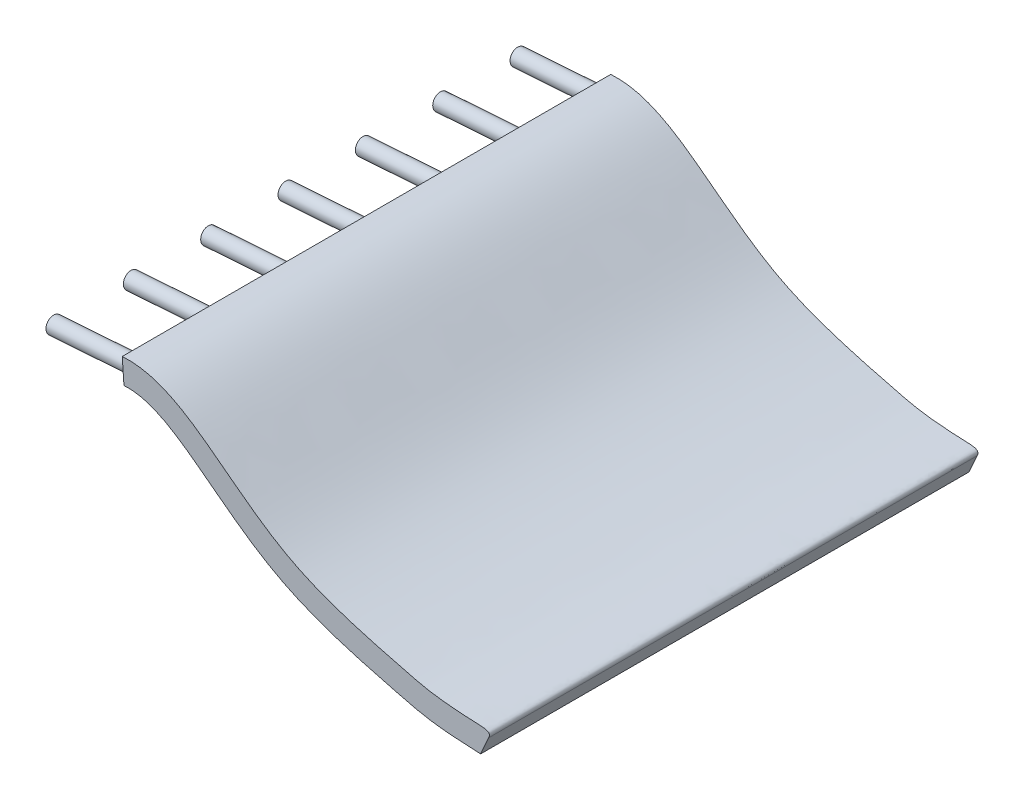
ISO-10303-21;
HEADER;
FILE_DESCRIPTION(('STEP AP214'),'2;1');
FILE_NAME('part.step','',(''),(''),'','','');
FILE_SCHEMA(('AUTOMOTIVE_DESIGN { 1 0 10303 214 1 1 1 1 }'));
ENDSEC;
DATA;
#1=APPLICATION_CONTEXT('core data for automotive mechanical design processes');
#2=APPLICATION_PROTOCOL_DEFINITION('international standard','automotive_design',2000,#1);
#3=PRODUCT_CONTEXT('',#1,'mechanical');
#4=PRODUCT('Part','Part','',(#3));
#5=PRODUCT_RELATED_PRODUCT_CATEGORY('part','',(#4));
#6=PRODUCT_DEFINITION_FORMATION('','',#4);
#7=PRODUCT_DEFINITION_CONTEXT('part definition',#1,'design');
#8=PRODUCT_DEFINITION('design','',#6,#7);
#9=PRODUCT_DEFINITION_SHAPE('','',#8);
#10=(LENGTH_UNIT() NAMED_UNIT(*) SI_UNIT(.MILLI.,.METRE.));
#11=(NAMED_UNIT(*) PLANE_ANGLE_UNIT() SI_UNIT($,.RADIAN.));
#12=(NAMED_UNIT(*) SI_UNIT($,.STERADIAN.) SOLID_ANGLE_UNIT());
#13=UNCERTAINTY_MEASURE_WITH_UNIT(LENGTH_MEASURE(1.E-05),#10,'distance_accuracy_value','');
#14=(GEOMETRIC_REPRESENTATION_CONTEXT(3) GLOBAL_UNCERTAINTY_ASSIGNED_CONTEXT((#13)) GLOBAL_UNIT_ASSIGNED_CONTEXT((#10,
#11,#12)) REPRESENTATION_CONTEXT('',''));
#15=CARTESIAN_POINT('',(0.,0.,0.));
#16=DIRECTION('',(0.,0.,1.));
#17=DIRECTION('',(1.,0.,0.));
#18=AXIS2_PLACEMENT_3D('',#15,#16,#17);
#19=CARTESIAN_POINT('',(-89.5782711069557,29.0148396228028,120.));
#20=CARTESIAN_POINT('',(-88.5788745714102,29.0852595227028,120.));
#21=CARTESIAN_POINT('',(-87.5748895929861,29.0488588934307,120.));
#22=CARTESIAN_POINT('',(-85.5923502423847,28.7762039668282,120.));
#23=CARTESIAN_POINT('',(-84.6157018536829,28.5411833087124,120.));
#24=CARTESIAN_POINT('',(-81.7600272805572,27.616018755678,120.));
#25=CARTESIAN_POINT('',(-79.958318560821,26.7150148244419,120.));
#26=CARTESIAN_POINT('',(-76.5128749573955,24.6783188927061,120.));
#27=CARTESIAN_POINT('',(-74.8651661074516,23.5379519561996,120.));
#28=CARTESIAN_POINT('',(-71.6290880763066,21.1827426408572,120.));
#29=CARTESIAN_POINT('',(-70.0373481121337,19.9694756570549,120.));
#30=CARTESIAN_POINT('',(-65.265700573195,16.3260422989031,120.));
#31=CARTESIAN_POINT('',(-62.0892937119194,13.8862970299809,120.));
#32=CARTESIAN_POINT('',(-57.1153395548174,10.5243025454225,120.));
#33=CARTESIAN_POINT('',(-55.4236272217225,9.45287686875714,120.));
#34=CARTESIAN_POINT('',(-51.9579462982462,7.45081101584747,120.));
#35=CARTESIAN_POINT('',(-50.1832911006533,6.52177529969392,120.));
#36=CARTESIAN_POINT('',(-44.7440153756463,3.98061287700183,120.));
#37=CARTESIAN_POINT('',(-40.9840720112804,2.58508442100853,120.));
#38=CARTESIAN_POINT('',(-33.3689059690432,0.118083423826716,120.));
#39=CARTESIAN_POINT('',(-29.50822843612,-0.945331912290822,120.));
#40=CARTESIAN_POINT('',(-24.6642641060712,-2.1967424083864,120.));
#41=CARTESIAN_POINT('',(-23.6943033797613,-2.44341758935134,120.));
#42=CARTESIAN_POINT('',(-21.7547502996779,-2.93630381884338,120.));
#43=CARTESIAN_POINT('',(-20.7861978354784,-3.18666718327389,120.));
#44=CARTESIAN_POINT('',(-18.8433374233269,-3.6663508337957,120.));
#45=CARTESIAN_POINT('',(-17.8683323390102,-3.89227769542912,120.));
#46=CARTESIAN_POINT('',(-15.9068094398935,-4.28880121544338,120.));
#47=CARTESIAN_POINT('',(-14.9205291338249,-4.4596088031401,120.));
#48=CARTESIAN_POINT('',(-11.9503978095905,-4.89449572475312,120.));
#49=CARTESIAN_POINT('',(-9.95669695138381,-5.08382035494162,120.));
#50=CARTESIAN_POINT('',(-6.96229450226059,-5.29444013196431,120.));
#51=CARTESIAN_POINT('',(-5.96429668896949,-5.35206227613983,120.));
#52=CARTESIAN_POINT('',(-4.71505466343444,-5.41346690071947,120.));
#53=CARTESIAN_POINT('',(-4.46037734244533,-5.42542648013207,120.));
#54=CARTESIAN_POINT('',(-4.08553085422644,-5.44227774819707,120.));
#55=CARTESIAN_POINT('',(-3.96055501744004,-5.44777158984196,120.));
#56=CARTESIAN_POINT('',(-3.71063598758482,-5.45851985330803,120.));
#57=CARTESIAN_POINT('',(-3.5915913532457,-5.46352796969448,120.));
#58=CARTESIAN_POINT('',(-3.34165305400548,-5.47381841303846,120.));
#59=CARTESIAN_POINT('',(-3.22150106621299,-5.47866436513372,120.));
#60=CARTESIAN_POINT('',(-2.97154438169385,-5.48849810885144,120.));
#61=CARTESIAN_POINT('',(-2.83952720774999,-5.49349483837178,120.));
#62=CARTESIAN_POINT('',(-2.5895818362063,-5.50361204624688,120.));
#63=CARTESIAN_POINT('',(-2.46467827480321,-5.50901607886369,120.));
#64=CARTESIAN_POINT('',(-2.27735309499773,-5.5193959031495,120.));
#65=CARTESIAN_POINT('',(-2.21489765821532,-5.52318956159871,120.));
#66=CARTESIAN_POINT('',(-2.12134478889138,-5.53007988645307,120.));
#67=CARTESIAN_POINT('',(-2.09026900707449,-5.53261534072826,120.));
#68=CARTESIAN_POINT('',(-2.04356831494609,-5.53696842452744,120.));
#69=CARTESIAN_POINT('',(-2.02800982186864,-5.53850415516752,120.));
#70=CARTESIAN_POINT('',(-2.00468769173897,-5.54096469213609,120.));
#71=CARTESIAN_POINT('',(-1.99691267950356,-5.5418114212595,120.));
#72=CARTESIAN_POINT('',(-1.9852614459041,-5.54313155557106,120.));
#73=CARTESIAN_POINT('',(-1.98133830688529,-5.54358473828337,120.));
#74=CARTESIAN_POINT('',(-1.97551612066339,-5.54427441019446,120.));
#75=CARTESIAN_POINT('',(-1.97356374097091,-5.54450855327664,120.));
#76=CARTESIAN_POINT('',(-1.96997565195764,-5.54494602119156,120.));
#77=CARTESIAN_POINT('',(-1.96554537792043,-5.54559414036753,120.));
#78=CARTESIAN_POINT('',(-1.96542701425129,-5.54555882504175,120.));
#79=CARTESIAN_POINT('',(-1.9426014128865,-5.53874851276974,120.));
#80=CARTESIAN_POINT('',(-1.91977581152171,-5.53193820049773,120.));
#81=CARTESIAN_POINT('',(-1.89695021015692,-5.52512788822573,120.));
#82=B_SPLINE_CURVE_WITH_KNOTS('',3,(#19,#20,#21,#22,#23,#24,#25,#26,#27,#28,#29,#30,#31,#32,#33,
#34,#35,#36,#37,#38,#39,#40,#41,#42,#43,#44,#45,#46,#47,#48,#49,#50,#51,#52,#53,#54,#55,#56,#57,
#58,#59,#60,#61,#62,#63,#64,#65,#66,#67,#68,#69,#70,#71,#72,#73,#74,#75,#76,#77,#78,#79,#80,
#81),.UNSPECIFIED.,.F.,.F.,(4,2,2,2,2,2,2,2,2,2,2,2,2,2,2,2,2,2,2,2,2,2,2,2,2,2,2,2,2,3,4),(0.,
0.00300180057928374,0.00600360115856748,0.012007202317135,0.0180108034757024,0.0240144046342699,
0.0360216069514049,0.0420252081099723,0.0480288092685398,0.0600360115856748,0.0720432139028097,
0.0750450144820934,0.0780468150613772,0.0810486156406609,0.0840504162199447,0.0900540173785121,
0.0930558179577959,0.0938062681026168,0.0941814931750273,0.0945567182474377,0.0949319433198482,
0.0953071683922587,0.0956823934646691,0.0958700060008744,0.095963812268977,0.0960107154030283,
0.096034166970054,0.0960458927535668,0.0960517556453232,0.0960567367310886,0.0970173040983995),.UNSPECIFIED.);
#83=DIRECTION('',(0.,0.,-1.));
#84=VECTOR('',#83,1.);
#85=SURFACE_OF_LINEAR_EXTRUSION('',#82,#84);
#86=CARTESIAN_POINT('',(-89.5782711069557,29.0148396228028,0.));
#87=CARTESIAN_POINT('',(-88.5788745714102,29.0852595227028,0.));
#88=CARTESIAN_POINT('',(-87.5748895929861,29.0488588934307,0.));
#89=CARTESIAN_POINT('',(-85.5923502423847,28.7762039668282,0.));
#90=CARTESIAN_POINT('',(-84.6157018536829,28.5411833087124,0.));
#91=CARTESIAN_POINT('',(-81.7600272805572,27.616018755678,0.));
#92=CARTESIAN_POINT('',(-79.958318560821,26.7150148244419,0.));
#93=CARTESIAN_POINT('',(-76.5128749573955,24.6783188927061,0.));
#94=CARTESIAN_POINT('',(-74.8651661074516,23.5379519561996,0.));
#95=CARTESIAN_POINT('',(-71.6290880763066,21.1827426408572,0.));
#96=CARTESIAN_POINT('',(-70.0373481121337,19.9694756570549,0.));
#97=CARTESIAN_POINT('',(-65.265700573195,16.3260422989031,0.));
#98=CARTESIAN_POINT('',(-62.0892937119194,13.8862970299809,0.));
#99=CARTESIAN_POINT('',(-57.1153395548174,10.5243025454225,0.));
#100=CARTESIAN_POINT('',(-55.4236272217225,9.45287686875714,0.));
#101=CARTESIAN_POINT('',(-51.9579462982462,7.45081101584747,0.));
#102=CARTESIAN_POINT('',(-50.1832911006533,6.52177529969392,0.));
#103=CARTESIAN_POINT('',(-44.7440153756463,3.98061287700183,0.));
#104=CARTESIAN_POINT('',(-40.9840720112804,2.58508442100853,0.));
#105=CARTESIAN_POINT('',(-33.3689059690432,0.118083423826716,0.));
#106=CARTESIAN_POINT('',(-29.50822843612,-0.945331912290822,0.));
#107=CARTESIAN_POINT('',(-24.6642641060712,-2.1967424083864,0.));
#108=CARTESIAN_POINT('',(-23.6943033797613,-2.44341758935134,0.));
#109=CARTESIAN_POINT('',(-21.7547502996779,-2.93630381884338,0.));
#110=CARTESIAN_POINT('',(-20.7861978354784,-3.18666718327389,0.));
#111=CARTESIAN_POINT('',(-18.8433374233269,-3.6663508337957,0.));
#112=CARTESIAN_POINT('',(-17.8683323390102,-3.89227769542912,0.));
#113=CARTESIAN_POINT('',(-15.9068094398935,-4.28880121544338,0.));
#114=CARTESIAN_POINT('',(-14.9205291338249,-4.4596088031401,0.));
#115=CARTESIAN_POINT('',(-11.9503978095905,-4.89449572475312,0.));
#116=CARTESIAN_POINT('',(-9.95669695138381,-5.08382035494162,0.));
#117=CARTESIAN_POINT('',(-6.96229450226059,-5.29444013196431,0.));
#118=CARTESIAN_POINT('',(-5.96429668896949,-5.35206227613983,0.));
#119=CARTESIAN_POINT('',(-4.71505466343444,-5.41346690071947,0.));
#120=CARTESIAN_POINT('',(-4.46037734244533,-5.42542648013207,0.));
#121=CARTESIAN_POINT('',(-4.08553085422644,-5.44227774819707,0.));
#122=CARTESIAN_POINT('',(-3.96055501744004,-5.44777158984196,0.));
#123=CARTESIAN_POINT('',(-3.71063598758482,-5.45851985330803,0.));
#124=CARTESIAN_POINT('',(-3.5915913532457,-5.46352796969448,0.));
#125=CARTESIAN_POINT('',(-3.34165305400548,-5.47381841303846,0.));
#126=CARTESIAN_POINT('',(-3.22150106621299,-5.47866436513372,0.));
#127=CARTESIAN_POINT('',(-2.97154438169385,-5.48849810885144,0.));
#128=CARTESIAN_POINT('',(-2.83952720774999,-5.49349483837178,0.));
#129=CARTESIAN_POINT('',(-2.5895818362063,-5.50361204624688,0.));
#130=CARTESIAN_POINT('',(-2.46467827480321,-5.50901607886369,0.));
#131=CARTESIAN_POINT('',(-2.27735309499773,-5.5193959031495,0.));
#132=CARTESIAN_POINT('',(-2.21489765821532,-5.52318956159871,0.));
#133=CARTESIAN_POINT('',(-2.12134478889138,-5.53007988645307,0.));
#134=CARTESIAN_POINT('',(-2.09026900707449,-5.53261534072826,0.));
#135=CARTESIAN_POINT('',(-2.04356831494609,-5.53696842452744,0.));
#136=CARTESIAN_POINT('',(-2.02800982186864,-5.53850415516752,0.));
#137=CARTESIAN_POINT('',(-2.00468769173897,-5.54096469213609,0.));
#138=CARTESIAN_POINT('',(-1.99691267950356,-5.5418114212595,0.));
#139=CARTESIAN_POINT('',(-1.9852614459041,-5.54313155557106,0.));
#140=CARTESIAN_POINT('',(-1.98133830688529,-5.54358473828337,0.));
#141=CARTESIAN_POINT('',(-1.97551612066339,-5.54427441019446,0.));
#142=CARTESIAN_POINT('',(-1.97356374097091,-5.54450855327664,0.));
#143=CARTESIAN_POINT('',(-1.96997565195764,-5.54494602119156,0.));
#144=CARTESIAN_POINT('',(-1.96554537792043,-5.54559414036753,0.));
#145=CARTESIAN_POINT('',(-1.96542701425129,-5.54555882504175,0.));
#146=CARTESIAN_POINT('',(-1.9426014128865,-5.53874851276974,0.));
#147=CARTESIAN_POINT('',(-1.91977581152171,-5.53193820049773,0.));
#148=CARTESIAN_POINT('',(-1.89695021015692,-5.52512788822573,0.));
#149=B_SPLINE_CURVE_WITH_KNOTS('',3,(#86,#87,#88,#89,#90,#91,#92,#93,#94,#95,#96,#97,#98,#99,
#100,#101,#102,#103,#104,#105,#106,#107,#108,#109,#110,#111,#112,#113,#114,#115,#116,#117,#118,
#119,#120,#121,#122,#123,#124,#125,#126,#127,#128,#129,#130,#131,#132,#133,#134,#135,#136,#137,
#138,#139,#140,#141,#142,#143,#144,#145,#146,#147,#148),.UNSPECIFIED.,.F.,.F.,(4,2,2,2,2,2,2,2,
2,2,2,2,2,2,2,2,2,2,2,2,2,2,2,2,2,2,2,2,2,3,4),(0.,0.00300180057928374,0.00600360115856748,
0.012007202317135,0.0180108034757024,0.0240144046342699,0.0360216069514049,0.0420252081099723,
0.0480288092685398,0.0600360115856748,0.0720432139028097,0.0750450144820934,0.0780468150613772,
0.0810486156406609,0.0840504162199447,0.0900540173785121,0.0930558179577959,0.0938062681026168,
0.0941814931750273,0.0945567182474377,0.0949319433198482,0.0953071683922587,0.0956823934646691,
0.0958700060008744,0.095963812268977,0.0960107154030283,0.096034166970054,0.0960458927535668,
0.0960517556453232,0.0960567367310886,0.0970173040983995),.UNSPECIFIED.);
#150=CARTESIAN_POINT('',(-89.5782711069557,29.0148396228028,0.));
#151=VERTEX_POINT('',#150);
#152=CARTESIAN_POINT('',(-1.9658088949384,-5.54546954323433,0.));
#153=VERTEX_POINT('',#152);
#154=EDGE_CURVE('E155',#151,#153,#149,.T.);
#155=ORIENTED_EDGE('',*,*,#154,.T.);
#156=CARTESIAN_POINT('',(-1.9658154107309,-5.54552444007927,0.));
#157=DIRECTION('',(0.,0.,1.));
#158=VECTOR('',#157,1.);
#159=LINE('',#156,#158);
#160=CARTESIAN_POINT('',(-1.9658088949384,-5.54546954323433,120.));
#161=VERTEX_POINT('',#160);
#162=EDGE_CURVE('E11',#161,#153,#159,.F.);
#163=ORIENTED_EDGE('',*,*,#162,.F.);
#164=CARTESIAN_POINT('',(-1.89695021015692,-5.52512788822573,120.));
#165=CARTESIAN_POINT('',(-1.91977581152171,-5.53193820049773,120.));
#166=CARTESIAN_POINT('',(-1.9426014128865,-5.53874851276974,120.));
#167=CARTESIAN_POINT('',(-1.96542701425129,-5.54555882504175,120.));
#168=CARTESIAN_POINT('',(-1.96554537792043,-5.54559414036753,120.));
#169=CARTESIAN_POINT('',(-1.96997565195764,-5.54494602119156,120.));
#170=CARTESIAN_POINT('',(-1.97356374097091,-5.54450855327664,120.));
#171=CARTESIAN_POINT('',(-1.97551612066339,-5.54427441019446,120.));
#172=CARTESIAN_POINT('',(-1.98133830688529,-5.54358473828337,120.));
#173=CARTESIAN_POINT('',(-1.9852614459041,-5.54313155557106,120.));
#174=CARTESIAN_POINT('',(-1.99691267950356,-5.5418114212595,120.));
#175=CARTESIAN_POINT('',(-2.00468769173897,-5.54096469213609,120.));
#176=CARTESIAN_POINT('',(-2.02800982186864,-5.53850415516752,120.));
#177=CARTESIAN_POINT('',(-2.04356831494609,-5.53696842452744,120.));
#178=CARTESIAN_POINT('',(-2.09026900707449,-5.53261534072826,120.));
#179=CARTESIAN_POINT('',(-2.12134478889138,-5.53007988645307,120.));
#180=CARTESIAN_POINT('',(-2.21489765821532,-5.52318956159871,120.));
#181=CARTESIAN_POINT('',(-2.27735309499773,-5.5193959031495,120.));
#182=CARTESIAN_POINT('',(-2.46467827480321,-5.50901607886369,120.));
#183=CARTESIAN_POINT('',(-2.5895818362063,-5.50361204624688,120.));
#184=CARTESIAN_POINT('',(-2.83952720774999,-5.49349483837178,120.));
#185=CARTESIAN_POINT('',(-2.97154438169385,-5.48849810885144,120.));
#186=CARTESIAN_POINT('',(-3.22150106621299,-5.47866436513372,120.));
#187=CARTESIAN_POINT('',(-3.34165305400548,-5.47381841303846,120.));
#188=CARTESIAN_POINT('',(-3.5915913532457,-5.46352796969448,120.));
#189=CARTESIAN_POINT('',(-3.71063598758482,-5.45851985330803,120.));
#190=CARTESIAN_POINT('',(-3.96055501744004,-5.44777158984196,120.));
#191=CARTESIAN_POINT('',(-4.08553085422644,-5.44227774819707,120.));
#192=CARTESIAN_POINT('',(-4.46037734244533,-5.42542648013207,120.));
#193=CARTESIAN_POINT('',(-4.71505466343444,-5.41346690071947,120.));
#194=CARTESIAN_POINT('',(-5.96429668896949,-5.35206227613983,120.));
#195=CARTESIAN_POINT('',(-6.96229450226059,-5.29444013196431,120.));
#196=CARTESIAN_POINT('',(-9.95669695138381,-5.08382035494162,120.));
#197=CARTESIAN_POINT('',(-11.9503978095905,-4.89449572475312,120.));
#198=CARTESIAN_POINT('',(-14.9205291338249,-4.4596088031401,120.));
#199=CARTESIAN_POINT('',(-15.9068094398935,-4.28880121544338,120.));
#200=CARTESIAN_POINT('',(-17.8683323390102,-3.89227769542912,120.));
#201=CARTESIAN_POINT('',(-18.8433374233269,-3.6663508337957,120.));
#202=CARTESIAN_POINT('',(-20.7861978354784,-3.18666718327389,120.));
#203=CARTESIAN_POINT('',(-21.7547502996779,-2.93630381884338,120.));
#204=CARTESIAN_POINT('',(-23.6943033797613,-2.44341758935134,120.));
#205=CARTESIAN_POINT('',(-24.6642641060712,-2.1967424083864,120.));
#206=CARTESIAN_POINT('',(-29.50822843612,-0.945331912290822,120.));
#207=CARTESIAN_POINT('',(-33.3689059690432,0.118083423826716,120.));
#208=CARTESIAN_POINT('',(-40.9840720112804,2.58508442100853,120.));
#209=CARTESIAN_POINT('',(-44.7440153756463,3.98061287700183,120.));
#210=CARTESIAN_POINT('',(-50.1832911006533,6.52177529969392,120.));
#211=CARTESIAN_POINT('',(-51.9579462982462,7.45081101584747,120.));
#212=CARTESIAN_POINT('',(-55.4236272217225,9.45287686875714,120.));
#213=CARTESIAN_POINT('',(-57.1153395548174,10.5243025454225,120.));
#214=CARTESIAN_POINT('',(-62.0892937119194,13.8862970299809,120.));
#215=CARTESIAN_POINT('',(-65.265700573195,16.3260422989031,120.));
#216=CARTESIAN_POINT('',(-70.0373481121337,19.9694756570549,120.));
#217=CARTESIAN_POINT('',(-71.6290880763066,21.1827426408572,120.));
#218=CARTESIAN_POINT('',(-74.8651661074516,23.5379519561996,120.));
#219=CARTESIAN_POINT('',(-76.5128749573955,24.6783188927061,120.));
#220=CARTESIAN_POINT('',(-79.958318560821,26.7150148244419,120.));
#221=CARTESIAN_POINT('',(-81.7600272805572,27.616018755678,120.));
#222=CARTESIAN_POINT('',(-84.6157018536829,28.5411833087124,120.));
#223=CARTESIAN_POINT('',(-85.5923502423847,28.7762039668282,120.));
#224=CARTESIAN_POINT('',(-87.5748895929861,29.0488588934307,120.));
#225=CARTESIAN_POINT('',(-88.5788745714102,29.0852595227028,120.));
#226=CARTESIAN_POINT('',(-89.5782711069557,29.0148396228028,120.));
#227=B_SPLINE_CURVE_WITH_KNOTS('',3,(#164,#165,#166,#167,#168,#169,#170,#171,#172,#173,#174,
#175,#176,#177,#178,#179,#180,#181,#182,#183,#184,#185,#186,#187,#188,#189,#190,#191,#192,#193,
#194,#195,#196,#197,#198,#199,#200,#201,#202,#203,#204,#205,#206,#207,#208,#209,#210,#211,#212,
#213,#214,#215,#216,#217,#218,#219,#220,#221,#222,#223,#224,#225,#226),.UNSPECIFIED.,.F.,.F.,(4,
3,2,2,2,2,2,2,2,2,2,2,2,2,2,2,2,2,2,2,2,2,2,2,2,2,2,2,2,2,4),(0.,0.000960567367310886,
0.000965548453076295,0.000971411344832709,0.000983137128345538,0.00100658869537119,
0.00105349182942251,0.00114729809752512,0.00133491063373035,0.00171013570614081,
0.00208536077855127,0.00246058585096175,0.00283581092337222,0.00321103599578268,
0.00396148614060361,0.00696328671988736,0.0129668878784548,0.0159686884577386,
0.0189704890370223,0.0219722896163061,0.0249740901955898,0.0369812925127247,0.0489884948298597,
0.0549920959884272,0.0609956971469946,0.0730028994641296,0.0790065006226971,0.0850101017812645,
0.091013702939832,0.0940155035191158,0.0970173040983995),.UNSPECIFIED.);
#228=CARTESIAN_POINT('',(-89.5782711069557,29.0148396228028,120.));
#229=VERTEX_POINT('',#228);
#230=EDGE_CURVE('E82',#229,#161,#227,.F.);
#231=ORIENTED_EDGE('',*,*,#230,.F.);
#232=CARTESIAN_POINT('',(-89.5782711069557,29.0148396228028,120.));
#233=DIRECTION('',(0.,0.,-1.));
#234=VECTOR('',#233,1.);
#235=LINE('',#232,#234);
#236=EDGE_CURVE('E56',#229,#151,#235,.T.);
#237=ORIENTED_EDGE('',*,*,#236,.T.);
#238=EDGE_LOOP('',(#155,#163,#231,#237));
#239=FACE_BOUND('',#238,.T.);
#240=ADVANCED_FACE('F35',(#239),#85,.F.);
#241=CARTESIAN_POINT('',(0.,-1.13898709175271,120.));
#242=DIRECTION('',(0.913243602636564,-0.407413944586326,0.));
#243=DIRECTION('',(0.407413944586326,0.913243602636564,0.));
#244=AXIS2_PLACEMENT_3D('',#241,#242,#243);
#245=PLANE('',#244);
#246=DIRECTION('',(-0.407413944586326,-0.913243602636564,0.));
#247=VECTOR('',#246,1.);
#248=CARTESIAN_POINT('',(0.,-1.13898709175271,0.));
#249=LINE('',#248,#247);
#250=CARTESIAN_POINT('',(0.,-1.13898709175271,0.));
#251=VERTEX_POINT('',#250);
#252=EDGE_CURVE('E92',#251,#153,#249,.T.);
#253=ORIENTED_EDGE('',*,*,#252,.F.);
#254=DIRECTION('',(0.,0.,-1.));
#255=VECTOR('',#254,1.);
#256=CARTESIAN_POINT('',(0.,-1.13898709175271,120.));
#257=LINE('',#256,#255);
#258=CARTESIAN_POINT('',(0.,-1.13898709175271,120.));
#259=VERTEX_POINT('',#258);
#260=EDGE_CURVE('E48',#259,#251,#257,.T.);
#261=ORIENTED_EDGE('',*,*,#260,.F.);
#262=DIRECTION('',(-0.407413944586326,-0.913243602636564,0.));
#263=VECTOR('',#262,1.);
#264=CARTESIAN_POINT('',(0.,-1.13898709175271,120.));
#265=LINE('',#264,#263);
#266=EDGE_CURVE('E90',#259,#161,#265,.T.);
#267=ORIENTED_EDGE('',*,*,#266,.T.);
#268=ORIENTED_EDGE('',*,*,#162,.T.);
#269=EDGE_LOOP('',(#253,#261,#267,#268));
#270=FACE_BOUND('',#269,.T.);
#271=ADVANCED_FACE('F89',(#270),#245,.T.);
#272=CARTESIAN_POINT('',(-90.,35.,120.));
#273=CARTESIAN_POINT('',(-81.7062886697523,35.5843949832756,120.));
#274=CARTESIAN_POINT('',(-67.1962399380975,25.959913142549,120.));
#275=CARTESIAN_POINT('',(-48.1745651020279,9.79098439786464,120.));
#276=CARTESIAN_POINT('',(-20.2581786436632,2.94036941674066,120.));
#277=CARTESIAN_POINT('',(-12.1318433378749,0.752448898406228,120.));
#278=CARTESIAN_POINT('',(0.8651520115418,0.387490639905987,120.));
#279=CARTESIAN_POINT('',(0.,-1.13898709175271,120.));
#280=B_SPLINE_CURVE_WITH_KNOTS('',3,(#272,#273,#274,#275,#276,#277,#278,#279),.UNSPECIFIED.,.F.,
.F.,(4,1,1,1,1,4),(0.,0.239479743360754,0.49970774331392,0.781902406913316,0.967873304282653,
1.),.UNSPECIFIED.);
#281=DIRECTION('',(0.,0.,-1.));
#282=VECTOR('',#281,1.);
#283=SURFACE_OF_LINEAR_EXTRUSION('',#280,#282);
#284=CARTESIAN_POINT('',(-90.,35.,0.));
#285=CARTESIAN_POINT('',(-81.7062886697523,35.5843949832756,0.));
#286=CARTESIAN_POINT('',(-67.1962399380975,25.959913142549,0.));
#287=CARTESIAN_POINT('',(-48.1745651020279,9.79098439786464,0.));
#288=CARTESIAN_POINT('',(-20.2581786436632,2.94036941674066,0.));
#289=CARTESIAN_POINT('',(-12.1318433378749,0.752448898406228,0.));
#290=CARTESIAN_POINT('',(0.8651520115418,0.387490639905987,0.));
#291=CARTESIAN_POINT('',(0.,-1.13898709175271,0.));
#292=B_SPLINE_CURVE_WITH_KNOTS('',3,(#284,#285,#286,#287,#288,#289,#290,#291),.UNSPECIFIED.,.F.,
.F.,(4,1,1,1,1,4),(0.,0.239479743360754,0.49970774331392,0.781902406913316,0.967873304282653,
1.),.UNSPECIFIED.);
#293=CARTESIAN_POINT('',(-90.,35.,0.));
#294=VERTEX_POINT('',#293);
#295=EDGE_CURVE('E112',#294,#251,#292,.T.);
#296=ORIENTED_EDGE('',*,*,#295,.F.);
#297=DIRECTION('',(0.,0.,-1.));
#298=VECTOR('',#297,1.);
#299=CARTESIAN_POINT('',(-90.,35.,120.));
#300=LINE('',#299,#298);
#301=CARTESIAN_POINT('',(-90.,35.,120.));
#302=VERTEX_POINT('',#301);
#303=EDGE_CURVE('E70',#302,#294,#300,.T.);
#304=ORIENTED_EDGE('',*,*,#303,.F.);
#305=EDGE_CURVE('E99',#302,#259,#280,.T.);
#306=ORIENTED_EDGE('',*,*,#305,.T.);
#307=ORIENTED_EDGE('',*,*,#260,.T.);
#308=EDGE_LOOP('',(#296,#304,#306,#307));
#309=FACE_BOUND('',#308,.T.);
#310=ADVANCED_FACE('F101',(#309),#283,.T.);
#311=CARTESIAN_POINT('',(-89.5782711069557,29.0148396228028,120.));
#312=DIRECTION('',(-0.997526729532871,-0.0702881488407123,0.));
#313=DIRECTION('',(0.0702881488407123,-0.997526729532871,0.));
#314=AXIS2_PLACEMENT_3D('',#311,#312,#313);
#315=PLANE('',#314);
#316=CARTESIAN_POINT('',(-89.7731059257065,31.7799279449883,41.));
#317=DIRECTION('',(-0.997526729532871,-0.0702881488407123,0.));
#318=DIRECTION('',(0.0702881488407123,-0.997526729532871,0.));
#319=AXIS2_PLACEMENT_3D('',#316,#317,#318);
#320=CIRCLE('',#319,2.);
#321=CARTESIAN_POINT('',(-89.632529628025,29.7848744859225,41.));
#322=VERTEX_POINT('',#321);
#323=EDGE_CURVE('E384',#322,#322,#320,.T.);
#324=ORIENTED_EDGE('',*,*,#323,.F.);
#325=EDGE_LOOP('',(#324));
#326=FACE_BOUND('',#325,.T.);
#327=CARTESIAN_POINT('',(-89.7731059257065,31.7799279449883,22.));
#328=DIRECTION('',(-0.997526729532871,-0.0702881488407123,0.));
#329=DIRECTION('',(0.0702881488407123,-0.997526729532871,0.));
#330=AXIS2_PLACEMENT_3D('',#327,#328,#329);
#331=CIRCLE('',#330,2.);
#332=CARTESIAN_POINT('',(-89.632529628025,29.7848744859225,22.));
#333=VERTEX_POINT('',#332);
#334=EDGE_CURVE('E383',#333,#333,#331,.T.);
#335=ORIENTED_EDGE('',*,*,#334,.F.);
#336=EDGE_LOOP('',(#335));
#337=FACE_BOUND('',#336,.T.);
#338=CARTESIAN_POINT('',(-89.7731059257065,31.7799279449883,3.));
#339=DIRECTION('',(-0.997526729532871,-0.0702881488407123,0.));
#340=DIRECTION('',(0.0702881488407123,-0.997526729532871,0.));
#341=AXIS2_PLACEMENT_3D('',#338,#339,#340);
#342=CIRCLE('',#341,2.);
#343=CARTESIAN_POINT('',(-89.632529628025,29.7848744859225,3.));
#344=VERTEX_POINT('',#343);
#345=EDGE_CURVE('E393',#344,#344,#342,.T.);
#346=ORIENTED_EDGE('',*,*,#345,.F.);
#347=EDGE_LOOP('',(#346));
#348=FACE_BOUND('',#347,.T.);
#349=CARTESIAN_POINT('',(-89.7731059257065,31.7799279449883,117.));
#350=DIRECTION('',(-0.997526729532871,-0.0702881488407123,0.));
#351=DIRECTION('',(0.0702881488407123,-0.997526729532871,0.));
#352=AXIS2_PLACEMENT_3D('',#349,#350,#351);
#353=CIRCLE('',#352,2.);
#354=CARTESIAN_POINT('',(-89.632529628025,29.7848744859225,117.));
#355=VERTEX_POINT('',#354);
#356=EDGE_CURVE('E398',#355,#355,#353,.T.);
#357=ORIENTED_EDGE('',*,*,#356,.F.);
#358=EDGE_LOOP('',(#357));
#359=FACE_BOUND('',#358,.T.);
#360=CARTESIAN_POINT('',(-89.7731059257065,31.7799279449883,98.));
#361=DIRECTION('',(-0.997526729532871,-0.0702881488407123,0.));
#362=DIRECTION('',(0.0702881488407123,-0.997526729532871,0.));
#363=AXIS2_PLACEMENT_3D('',#360,#361,#362);
#364=CIRCLE('',#363,2.);
#365=CARTESIAN_POINT('',(-89.632529628025,29.7848744859225,98.));
#366=VERTEX_POINT('',#365);
#367=EDGE_CURVE('E404',#366,#366,#364,.T.);
#368=ORIENTED_EDGE('',*,*,#367,.F.);
#369=EDGE_LOOP('',(#368));
#370=FACE_BOUND('',#369,.T.);
#371=CARTESIAN_POINT('',(-89.7731059257065,31.7799279449883,79.));
#372=DIRECTION('',(-0.997526729532871,-0.0702881488407123,0.));
#373=DIRECTION('',(0.0702881488407123,-0.997526729532871,0.));
#374=AXIS2_PLACEMENT_3D('',#371,#372,#373);
#375=CIRCLE('',#374,2.);
#376=CARTESIAN_POINT('',(-89.632529628025,29.7848744859225,79.));
#377=VERTEX_POINT('',#376);
#378=EDGE_CURVE('E410',#377,#377,#375,.T.);
#379=ORIENTED_EDGE('',*,*,#378,.F.);
#380=EDGE_LOOP('',(#379));
#381=FACE_BOUND('',#380,.T.);
#382=CARTESIAN_POINT('',(-89.7731059257065,31.7799279449883,60.));
#383=DIRECTION('',(-0.997526729532871,-0.0702881488407123,0.));
#384=DIRECTION('',(0.0702881488407123,-0.997526729532871,0.));
#385=AXIS2_PLACEMENT_3D('',#382,#383,#384);
#386=CIRCLE('',#385,2.);
#387=CARTESIAN_POINT('',(-89.632529628025,29.7848744859225,60.));
#388=VERTEX_POINT('',#387);
#389=EDGE_CURVE('E110',#388,#388,#386,.T.);
#390=ORIENTED_EDGE('',*,*,#389,.F.);
#391=EDGE_LOOP('',(#390));
#392=FACE_BOUND('',#391,.T.);
#393=DIRECTION('',(-0.0702881488407123,0.997526729532871,0.));
#394=VECTOR('',#393,1.);
#395=CARTESIAN_POINT('',(-89.5782711069557,29.0148396228028,0.));
#396=LINE('',#395,#394);
#397=EDGE_CURVE('E166',#151,#294,#396,.T.);
#398=ORIENTED_EDGE('',*,*,#397,.F.);
#399=ORIENTED_EDGE('',*,*,#236,.F.);
#400=DIRECTION('',(-0.0702881488407123,0.997526729532871,0.));
#401=VECTOR('',#400,1.);
#402=CARTESIAN_POINT('',(-89.5782711069557,29.0148396228028,120.));
#403=LINE('',#402,#401);
#404=EDGE_CURVE('E102',#229,#302,#403,.T.);
#405=ORIENTED_EDGE('',*,*,#404,.T.);
#406=ORIENTED_EDGE('',*,*,#303,.T.);
#407=EDGE_LOOP('',(#398,#399,#405,#406));
#408=FACE_BOUND('',#407,.T.);
#409=ADVANCED_FACE('F121',(#326,#337,#348,#359,#370,#381,#392,#408),#315,.T.);
#410=CARTESIAN_POINT('',(-48.3701991923176,5.67472115879656,120.));
#411=DIRECTION('',(0.,0.,1.));
#412=DIRECTION('',(1.,0.,0.));
#413=AXIS2_PLACEMENT_3D('',#410,#411,#412);
#414=PLANE('',#413);
#415=ORIENTED_EDGE('',*,*,#230,.T.);
#416=ORIENTED_EDGE('',*,*,#266,.F.);
#417=ORIENTED_EDGE('',*,*,#305,.F.);
#418=ORIENTED_EDGE('',*,*,#404,.F.);
#419=EDGE_LOOP('',(#415,#416,#417,#418));
#420=FACE_BOUND('',#419,.T.);
#421=ADVANCED_FACE('F98',(#420),#414,.T.);
#422=CARTESIAN_POINT('',(-48.3701991923176,5.67472115879656,0.));
#423=DIRECTION('',(0.,0.,1.));
#424=DIRECTION('',(1.,0.,0.));
#425=AXIS2_PLACEMENT_3D('',#422,#423,#424);
#426=PLANE('',#425);
#427=ORIENTED_EDGE('',*,*,#154,.F.);
#428=ORIENTED_EDGE('',*,*,#397,.T.);
#429=ORIENTED_EDGE('',*,*,#295,.T.);
#430=ORIENTED_EDGE('',*,*,#252,.T.);
#431=EDGE_LOOP('',(#427,#428,#429,#430));
#432=FACE_BOUND('',#431,.T.);
#433=ADVANCED_FACE('F165',(#432),#426,.F.);
#434=CARTESIAN_POINT('',(-109.723640516364,30.374164968174,60.));
#435=DIRECTION('',(0.997526729532871,0.0702881488407123,0.));
#436=DIRECTION('',(-0.0702881488407123,0.997526729532871,0.));
#437=AXIS2_PLACEMENT_3D('',#434,#435,#436);
#438=CYLINDRICAL_SURFACE('',#437,2.);
#439=CARTESIAN_POINT('',(-109.723640516364,30.374164968174,60.));
#440=DIRECTION('',(-0.997526729532871,-0.0702881488407123,0.));
#441=DIRECTION('',(0.0702881488407123,-0.997526729532871,0.));
#442=AXIS2_PLACEMENT_3D('',#439,#440,#441);
#443=CIRCLE('',#442,2.);
#444=CARTESIAN_POINT('',(-109.583064218682,28.3791115091083,60.));
#445=VERTEX_POINT('',#444);
#446=EDGE_CURVE('E167',#445,#445,#443,.T.);
#447=ORIENTED_EDGE('',*,*,#446,.F.);
#448=EDGE_LOOP('',(#447));
#449=FACE_BOUND('',#448,.T.);
#450=ORIENTED_EDGE('',*,*,#389,.T.);
#451=EDGE_LOOP('',(#450));
#452=FACE_BOUND('',#451,.T.);
#453=ADVANCED_FACE('F208',(#449,#452),#438,.T.);
#454=CARTESIAN_POINT('',(-109.723640516364,30.374164968174,60.));
#455=DIRECTION('',(-0.997526729532871,-0.0702881488407123,0.));
#456=DIRECTION('',(0.0702881488407123,-0.997526729532871,0.));
#457=AXIS2_PLACEMENT_3D('',#454,#455,#456);
#458=PLANE('',#457);
#459=ORIENTED_EDGE('',*,*,#446,.T.);
#460=EDGE_LOOP('',(#459));
#461=FACE_BOUND('',#460,.T.);
#462=ADVANCED_FACE('F215',(#461),#458,.T.);
#463=CARTESIAN_POINT('',(-109.723640516364,30.374164968174,79.));
#464=DIRECTION('',(0.997526729532871,0.0702881488407123,0.));
#465=DIRECTION('',(-0.0702881488407123,0.997526729532871,0.));
#466=AXIS2_PLACEMENT_3D('',#463,#464,#465);
#467=CYLINDRICAL_SURFACE('',#466,2.);
#468=CARTESIAN_POINT('',(-109.723640516364,30.374164968174,79.));
#469=DIRECTION('',(-0.997526729532871,-0.0702881488407123,0.));
#470=DIRECTION('',(0.0702881488407123,-0.997526729532871,0.));
#471=AXIS2_PLACEMENT_3D('',#468,#469,#470);
#472=CIRCLE('',#471,2.);
#473=CARTESIAN_POINT('',(-109.583064218682,28.3791115091083,79.));
#474=VERTEX_POINT('',#473);
#475=EDGE_CURVE('E413',#474,#474,#472,.T.);
#476=ORIENTED_EDGE('',*,*,#475,.F.);
#477=EDGE_LOOP('',(#476));
#478=FACE_BOUND('',#477,.T.);
#479=ORIENTED_EDGE('',*,*,#378,.T.);
#480=EDGE_LOOP('',(#479));
#481=FACE_BOUND('',#480,.T.);
#482=ADVANCED_FACE('F257',(#478,#481),#467,.T.);
#483=CARTESIAN_POINT('',(-109.723640516364,30.374164968174,79.));
#484=DIRECTION('',(-0.997526729532871,-0.0702881488407123,0.));
#485=DIRECTION('',(0.0702881488407123,-0.997526729532871,0.));
#486=AXIS2_PLACEMENT_3D('',#483,#484,#485);
#487=PLANE('',#486);
#488=ORIENTED_EDGE('',*,*,#475,.T.);
#489=EDGE_LOOP('',(#488));
#490=FACE_BOUND('',#489,.T.);
#491=ADVANCED_FACE('F265',(#490),#487,.T.);
#492=CARTESIAN_POINT('',(-109.723640516364,30.374164968174,98.));
#493=DIRECTION('',(0.997526729532871,0.0702881488407123,0.));
#494=DIRECTION('',(-0.0702881488407123,0.997526729532871,0.));
#495=AXIS2_PLACEMENT_3D('',#492,#493,#494);
#496=CYLINDRICAL_SURFACE('',#495,2.);
#497=CARTESIAN_POINT('',(-109.723640516364,30.374164968174,98.));
#498=DIRECTION('',(-0.997526729532871,-0.0702881488407123,0.));
#499=DIRECTION('',(0.0702881488407123,-0.997526729532871,0.));
#500=AXIS2_PLACEMENT_3D('',#497,#498,#499);
#501=CIRCLE('',#500,2.);
#502=CARTESIAN_POINT('',(-109.583064218682,28.3791115091083,98.));
#503=VERTEX_POINT('',#502);
#504=EDGE_CURVE('E407',#503,#503,#501,.T.);
#505=ORIENTED_EDGE('',*,*,#504,.F.);
#506=EDGE_LOOP('',(#505));
#507=FACE_BOUND('',#506,.T.);
#508=ORIENTED_EDGE('',*,*,#367,.T.);
#509=EDGE_LOOP('',(#508));
#510=FACE_BOUND('',#509,.T.);
#511=ADVANCED_FACE('F274',(#507,#510),#496,.T.);
#512=CARTESIAN_POINT('',(-109.723640516364,30.374164968174,98.));
#513=DIRECTION('',(-0.997526729532871,-0.0702881488407123,0.));
#514=DIRECTION('',(0.0702881488407123,-0.997526729532871,0.));
#515=AXIS2_PLACEMENT_3D('',#512,#513,#514);
#516=PLANE('',#515);
#517=ORIENTED_EDGE('',*,*,#504,.T.);
#518=EDGE_LOOP('',(#517));
#519=FACE_BOUND('',#518,.T.);
#520=ADVANCED_FACE('F283',(#519),#516,.T.);
#521=CARTESIAN_POINT('',(-109.723640516364,30.374164968174,117.));
#522=DIRECTION('',(0.997526729532871,0.0702881488407123,0.));
#523=DIRECTION('',(-0.0702881488407123,0.997526729532871,0.));
#524=AXIS2_PLACEMENT_3D('',#521,#522,#523);
#525=CYLINDRICAL_SURFACE('',#524,2.);
#526=CARTESIAN_POINT('',(-109.723640516364,30.374164968174,117.));
#527=DIRECTION('',(-0.997526729532871,-0.0702881488407123,0.));
#528=DIRECTION('',(0.0702881488407123,-0.997526729532871,0.));
#529=AXIS2_PLACEMENT_3D('',#526,#527,#528);
#530=CIRCLE('',#529,2.);
#531=CARTESIAN_POINT('',(-109.583064218682,28.3791115091083,117.));
#532=VERTEX_POINT('',#531);
#533=EDGE_CURVE('E401',#532,#532,#530,.T.);
#534=ORIENTED_EDGE('',*,*,#533,.F.);
#535=EDGE_LOOP('',(#534));
#536=FACE_BOUND('',#535,.T.);
#537=ORIENTED_EDGE('',*,*,#356,.T.);
#538=EDGE_LOOP('',(#537));
#539=FACE_BOUND('',#538,.T.);
#540=ADVANCED_FACE('F292',(#536,#539),#525,.T.);
#541=CARTESIAN_POINT('',(-109.723640516364,30.374164968174,117.));
#542=DIRECTION('',(-0.997526729532871,-0.0702881488407123,0.));
#543=DIRECTION('',(0.0702881488407123,-0.997526729532871,0.));
#544=AXIS2_PLACEMENT_3D('',#541,#542,#543);
#545=PLANE('',#544);
#546=ORIENTED_EDGE('',*,*,#533,.T.);
#547=EDGE_LOOP('',(#546));
#548=FACE_BOUND('',#547,.T.);
#549=ADVANCED_FACE('F301',(#548),#545,.T.);
#550=CARTESIAN_POINT('',(-109.723640516364,30.374164968174,3.));
#551=DIRECTION('',(0.997526729532871,0.0702881488407123,0.));
#552=DIRECTION('',(-0.0702881488407123,0.997526729532871,0.));
#553=AXIS2_PLACEMENT_3D('',#550,#551,#552);
#554=CYLINDRICAL_SURFACE('',#553,2.);
#555=CARTESIAN_POINT('',(-109.723640516364,30.374164968174,3.));
#556=DIRECTION('',(-0.997526729532871,-0.0702881488407123,0.));
#557=DIRECTION('',(0.0702881488407123,-0.997526729532871,0.));
#558=AXIS2_PLACEMENT_3D('',#555,#556,#557);
#559=CIRCLE('',#558,2.);
#560=CARTESIAN_POINT('',(-109.583064218682,28.3791115091083,3.));
#561=VERTEX_POINT('',#560);
#562=EDGE_CURVE('E395',#561,#561,#559,.T.);
#563=ORIENTED_EDGE('',*,*,#562,.F.);
#564=EDGE_LOOP('',(#563));
#565=FACE_BOUND('',#564,.T.);
#566=ORIENTED_EDGE('',*,*,#345,.T.);
#567=EDGE_LOOP('',(#566));
#568=FACE_BOUND('',#567,.T.);
#569=ADVANCED_FACE('F310',(#565,#568),#554,.T.);
#570=CARTESIAN_POINT('',(-109.723640516364,30.374164968174,3.));
#571=DIRECTION('',(-0.997526729532871,-0.0702881488407123,0.));
#572=DIRECTION('',(0.0702881488407123,-0.997526729532871,0.));
#573=AXIS2_PLACEMENT_3D('',#570,#571,#572);
#574=PLANE('',#573);
#575=ORIENTED_EDGE('',*,*,#562,.T.);
#576=EDGE_LOOP('',(#575));
#577=FACE_BOUND('',#576,.T.);
#578=ADVANCED_FACE('F319',(#577),#574,.T.);
#579=CARTESIAN_POINT('',(-109.723640516364,30.374164968174,22.));
#580=DIRECTION('',(0.997526729532871,0.0702881488407123,0.));
#581=DIRECTION('',(-0.0702881488407123,0.997526729532871,0.));
#582=AXIS2_PLACEMENT_3D('',#579,#580,#581);
#583=CYLINDRICAL_SURFACE('',#582,2.);
#584=CARTESIAN_POINT('',(-109.723640516364,30.374164968174,22.));
#585=DIRECTION('',(-0.997526729532871,-0.0702881488407123,0.));
#586=DIRECTION('',(0.0702881488407123,-0.997526729532871,0.));
#587=AXIS2_PLACEMENT_3D('',#584,#585,#586);
#588=CIRCLE('',#587,2.);
#589=CARTESIAN_POINT('',(-109.583064218682,28.3791115091083,22.));
#590=VERTEX_POINT('',#589);
#591=EDGE_CURVE('E387',#590,#590,#588,.T.);
#592=ORIENTED_EDGE('',*,*,#591,.F.);
#593=EDGE_LOOP('',(#592));
#594=FACE_BOUND('',#593,.T.);
#595=ORIENTED_EDGE('',*,*,#334,.T.);
#596=EDGE_LOOP('',(#595));
#597=FACE_BOUND('',#596,.T.);
#598=ADVANCED_FACE('F328',(#594,#597),#583,.T.);
#599=CARTESIAN_POINT('',(-109.723640516364,30.374164968174,22.));
#600=DIRECTION('',(-0.997526729532871,-0.0702881488407123,0.));
#601=DIRECTION('',(0.0702881488407123,-0.997526729532871,0.));
#602=AXIS2_PLACEMENT_3D('',#599,#600,#601);
#603=PLANE('',#602);
#604=ORIENTED_EDGE('',*,*,#591,.T.);
#605=EDGE_LOOP('',(#604));
#606=FACE_BOUND('',#605,.T.);
#607=ADVANCED_FACE('F337',(#606),#603,.T.);
#608=CARTESIAN_POINT('',(-109.723640516364,30.374164968174,41.));
#609=DIRECTION('',(0.997526729532871,0.0702881488407123,0.));
#610=DIRECTION('',(-0.0702881488407123,0.997526729532871,0.));
#611=AXIS2_PLACEMENT_3D('',#608,#609,#610);
#612=CYLINDRICAL_SURFACE('',#611,2.);
#613=CARTESIAN_POINT('',(-109.723640516364,30.374164968174,41.));
#614=DIRECTION('',(-0.997526729532871,-0.0702881488407123,0.));
#615=DIRECTION('',(0.0702881488407123,-0.997526729532871,0.));
#616=AXIS2_PLACEMENT_3D('',#613,#614,#615);
#617=CIRCLE('',#616,2.);
#618=CARTESIAN_POINT('',(-109.583064218682,28.3791115091083,41.));
#619=VERTEX_POINT('',#618);
#620=EDGE_CURVE('E382',#619,#619,#617,.T.);
#621=ORIENTED_EDGE('',*,*,#620,.F.);
#622=EDGE_LOOP('',(#621));
#623=FACE_BOUND('',#622,.T.);
#624=ORIENTED_EDGE('',*,*,#323,.T.);
#625=EDGE_LOOP('',(#624));
#626=FACE_BOUND('',#625,.T.);
#627=ADVANCED_FACE('F346',(#623,#626),#612,.T.);
#628=CARTESIAN_POINT('',(-109.723640516364,30.374164968174,41.));
#629=DIRECTION('',(-0.997526729532871,-0.0702881488407123,0.));
#630=DIRECTION('',(0.0702881488407123,-0.997526729532871,0.));
#631=AXIS2_PLACEMENT_3D('',#628,#629,#630);
#632=PLANE('',#631);
#633=ORIENTED_EDGE('',*,*,#620,.T.);
#634=EDGE_LOOP('',(#633));
#635=FACE_BOUND('',#634,.T.);
#636=ADVANCED_FACE('F355',(#635),#632,.T.);
#637=CLOSED_SHELL('',(#240,#271,#310,#409,#421,#433,#453,#462,#482,#491,#511,#520,#540,#549,
#569,#578,#598,#607,#627,#636));
#638=MANIFOLD_SOLID_BREP('B2',#637);
#639=ADVANCED_BREP_SHAPE_REPRESENTATION('',(#18,#638),#14);
#640=SHAPE_DEFINITION_REPRESENTATION(#9,#639);
ENDSEC;
END-ISO-10303-21;
